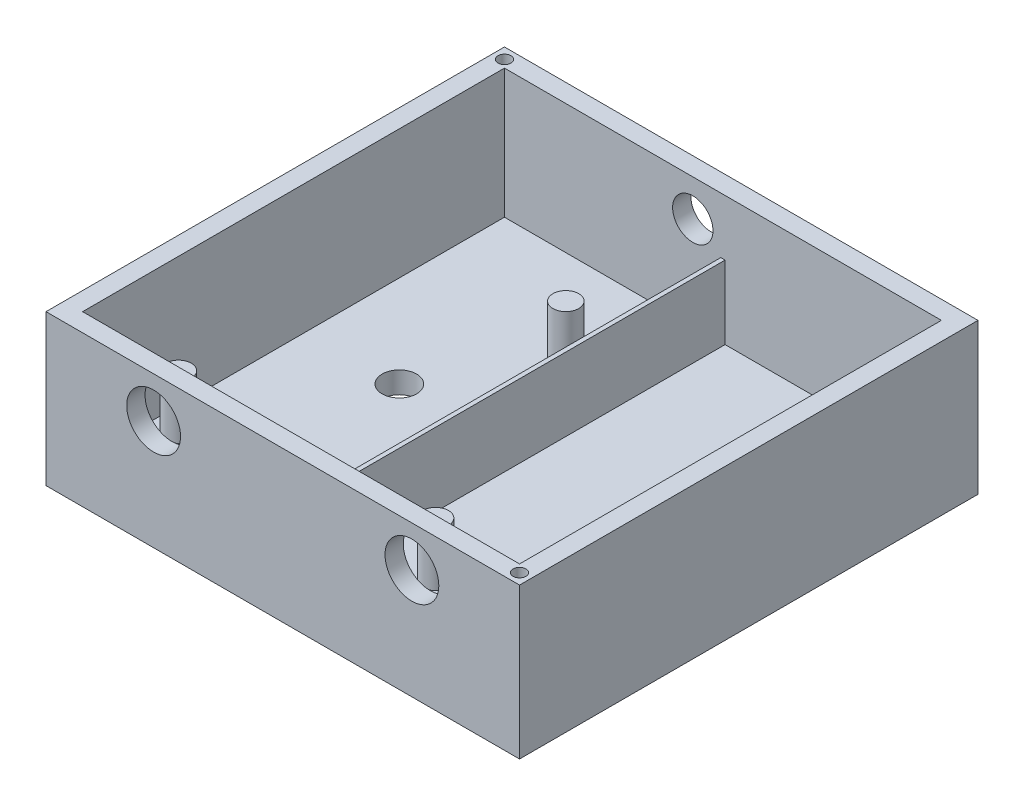
ISO-10303-21;
HEADER;
FILE_DESCRIPTION(('STEP AP214'),'2;1');
FILE_NAME('part.step','',(''),(''),'','','');
FILE_SCHEMA(('AUTOMOTIVE_DESIGN { 1 0 10303 214 1 1 1 1 }'));
ENDSEC;
DATA;
#1=APPLICATION_CONTEXT('core data for automotive mechanical design processes');
#2=APPLICATION_PROTOCOL_DEFINITION('international standard','automotive_design',2000,#1);
#3=PRODUCT_CONTEXT('',#1,'mechanical');
#4=PRODUCT('Part','Part','',(#3));
#5=PRODUCT_RELATED_PRODUCT_CATEGORY('part','',(#4));
#6=PRODUCT_DEFINITION_FORMATION('','',#4);
#7=PRODUCT_DEFINITION_CONTEXT('part definition',#1,'design');
#8=PRODUCT_DEFINITION('design','',#6,#7);
#9=PRODUCT_DEFINITION_SHAPE('','',#8);
#10=(LENGTH_UNIT() NAMED_UNIT(*) SI_UNIT(.MILLI.,.METRE.));
#11=(NAMED_UNIT(*) PLANE_ANGLE_UNIT() SI_UNIT($,.RADIAN.));
#12=(NAMED_UNIT(*) SI_UNIT($,.STERADIAN.) SOLID_ANGLE_UNIT());
#13=UNCERTAINTY_MEASURE_WITH_UNIT(LENGTH_MEASURE(1.E-05),#10,'distance_accuracy_value','');
#14=(GEOMETRIC_REPRESENTATION_CONTEXT(3) GLOBAL_UNCERTAINTY_ASSIGNED_CONTEXT((#13)) GLOBAL_UNIT_ASSIGNED_CONTEXT((#10,
#11,#12)) REPRESENTATION_CONTEXT('',''));
#15=CARTESIAN_POINT('',(0.,0.,0.));
#16=DIRECTION('',(0.,0.,1.));
#17=DIRECTION('',(1.,0.,0.));
#18=AXIS2_PLACEMENT_3D('',#15,#16,#17);
#19=CARTESIAN_POINT('',(2.15900000000001,2.54,-51.943));
#20=DIRECTION('',(0.,0.,-1.));
#21=DIRECTION('',(-1.,0.,0.));
#22=AXIS2_PLACEMENT_3D('',#19,#20,#21);
#23=PLANE('',#22);
#24=CARTESIAN_POINT('',(24.384,13.462,-51.943));
#25=DIRECTION('',(0.,0.,-1.));
#26=DIRECTION('',(-1.,0.,0.));
#27=AXIS2_PLACEMENT_3D('',#24,#25,#26);
#28=CIRCLE('',#27,2.38125);
#29=CARTESIAN_POINT('',(22.00275,13.462,-51.943));
#30=VERTEX_POINT('',#29);
#31=EDGE_CURVE('E269',#30,#30,#28,.T.);
#32=ORIENTED_EDGE('',*,*,#31,.T.);
#33=EDGE_LOOP('',(#32));
#34=FACE_BOUND('',#33,.T.);
#35=DIRECTION('',(0.,-1.,0.));
#36=VECTOR('',#35,1.);
#37=CARTESIAN_POINT('',(28.194,11.176,-51.943));
#38=LINE('',#37,#36);
#39=CARTESIAN_POINT('',(28.194,11.176,-51.943));
#40=VERTEX_POINT('',#39);
#41=CARTESIAN_POINT('',(28.194,2.54,-51.943));
#42=VERTEX_POINT('',#41);
#43=EDGE_CURVE('E136',#40,#42,#38,.T.);
#44=ORIENTED_EDGE('',*,*,#43,.T.);
#45=DIRECTION('',(-1.,0.,0.));
#46=VECTOR('',#45,1.);
#47=CARTESIAN_POINT('',(2.15900000000001,2.54,-51.943));
#48=LINE('',#47,#46);
#49=CARTESIAN_POINT('',(53.721,2.54,-51.943));
#50=VERTEX_POINT('',#49);
#51=EDGE_CURVE('E196',#50,#42,#48,.T.);
#52=ORIENTED_EDGE('',*,*,#51,.F.);
#53=DIRECTION('',(0.,1.,0.));
#54=VECTOR('',#53,1.);
#55=CARTESIAN_POINT('',(53.721,2.54,-51.943));
#56=LINE('',#55,#54);
#57=CARTESIAN_POINT('',(53.721,17.78,-51.943));
#58=VERTEX_POINT('',#57);
#59=EDGE_CURVE('E211',#50,#58,#56,.T.);
#60=ORIENTED_EDGE('',*,*,#59,.T.);
#61=DIRECTION('',(-1.,0.,0.));
#62=VECTOR('',#61,1.);
#63=CARTESIAN_POINT('',(2.15900000000001,17.78,-51.943));
#64=LINE('',#63,#62);
#65=CARTESIAN_POINT('',(2.15900000000001,17.78,-51.943));
#66=VERTEX_POINT('',#65);
#67=EDGE_CURVE('E188',#58,#66,#64,.T.);
#68=ORIENTED_EDGE('',*,*,#67,.T.);
#69=DIRECTION('',(0.,1.,0.));
#70=VECTOR('',#69,1.);
#71=CARTESIAN_POINT('',(2.15900000000001,2.54,-51.943));
#72=LINE('',#71,#70);
#73=CARTESIAN_POINT('',(2.15900000000001,2.54,-51.943));
#74=VERTEX_POINT('',#73);
#75=EDGE_CURVE('E208',#74,#66,#72,.T.);
#76=ORIENTED_EDGE('',*,*,#75,.F.);
#77=CARTESIAN_POINT('',(27.686,2.54,-51.943));
#78=VERTEX_POINT('',#77);
#79=EDGE_CURVE('E195',#78,#74,#48,.T.);
#80=ORIENTED_EDGE('',*,*,#79,.F.);
#81=DIRECTION('',(0.,-1.,0.));
#82=VECTOR('',#81,1.);
#83=CARTESIAN_POINT('',(27.686,11.176,-51.943));
#84=LINE('',#83,#82);
#85=CARTESIAN_POINT('',(27.686,11.176,-51.943));
#86=VERTEX_POINT('',#85);
#87=EDGE_CURVE('E50',#86,#78,#84,.T.);
#88=ORIENTED_EDGE('',*,*,#87,.F.);
#89=DIRECTION('',(-1.,0.,0.));
#90=VECTOR('',#89,1.);
#91=CARTESIAN_POINT('',(27.686,11.176,-51.943));
#92=LINE('',#91,#90);
#93=EDGE_CURVE('E128',#40,#86,#92,.T.);
#94=ORIENTED_EDGE('',*,*,#93,.F.);
#95=EDGE_LOOP('',(#44,#52,#60,#68,#76,#80,#88,#94));
#96=FACE_BOUND('',#95,.T.);
#97=ADVANCED_FACE('F33',(#34,#96),#23,.F.);
#98=CARTESIAN_POINT('',(2.15900000000001,2.54,-2.159));
#99=DIRECTION('',(0.,0.,1.));
#100=DIRECTION('',(1.,0.,0.));
#101=AXIS2_PLACEMENT_3D('',#98,#99,#100);
#102=PLANE('',#101);
#103=CARTESIAN_POINT('',(12.7,12.954,-2.159));
#104=DIRECTION('',(0.,0.,1.));
#105=DIRECTION('',(1.,0.,0.));
#106=AXIS2_PLACEMENT_3D('',#103,#104,#105);
#107=CIRCLE('',#106,3.175);
#108=CARTESIAN_POINT('',(15.875,12.954,-2.159));
#109=VERTEX_POINT('',#108);
#110=EDGE_CURVE('E154',#109,#109,#107,.T.);
#111=ORIENTED_EDGE('',*,*,#110,.T.);
#112=EDGE_LOOP('',(#111));
#113=FACE_BOUND('',#112,.T.);
#114=CARTESIAN_POINT('',(43.18,12.954,-2.159));
#115=DIRECTION('',(0.,0.,1.));
#116=DIRECTION('',(1.,0.,0.));
#117=AXIS2_PLACEMENT_3D('',#114,#115,#116);
#118=CIRCLE('',#117,3.175);
#119=CARTESIAN_POINT('',(46.355,12.954,-2.159));
#120=VERTEX_POINT('',#119);
#121=EDGE_CURVE('E276',#120,#120,#118,.T.);
#122=ORIENTED_EDGE('',*,*,#121,.T.);
#123=EDGE_LOOP('',(#122));
#124=FACE_BOUND('',#123,.T.);
#125=DIRECTION('',(0.,-1.,0.));
#126=VECTOR('',#125,1.);
#127=CARTESIAN_POINT('',(28.194,11.176,-2.159));
#128=LINE('',#127,#126);
#129=CARTESIAN_POINT('',(28.194,11.176,-2.159));
#130=VERTEX_POINT('',#129);
#131=CARTESIAN_POINT('',(28.194,2.54,-2.159));
#132=VERTEX_POINT('',#131);
#133=EDGE_CURVE('E152',#130,#132,#128,.T.);
#134=ORIENTED_EDGE('',*,*,#133,.F.);
#135=DIRECTION('',(1.,0.,0.));
#136=VECTOR('',#135,1.);
#137=CARTESIAN_POINT('',(27.686,11.176,-2.159));
#138=LINE('',#137,#136);
#139=CARTESIAN_POINT('',(27.686,11.176,-2.159));
#140=VERTEX_POINT('',#139);
#141=EDGE_CURVE('E130',#140,#130,#138,.T.);
#142=ORIENTED_EDGE('',*,*,#141,.F.);
#143=DIRECTION('',(0.,-1.,0.));
#144=VECTOR('',#143,1.);
#145=CARTESIAN_POINT('',(27.686,11.176,-2.159));
#146=LINE('',#145,#144);
#147=CARTESIAN_POINT('',(27.686,2.54,-2.159));
#148=VERTEX_POINT('',#147);
#149=EDGE_CURVE('E157',#140,#148,#146,.T.);
#150=ORIENTED_EDGE('',*,*,#149,.T.);
#151=DIRECTION('',(1.,0.,0.));
#152=VECTOR('',#151,1.);
#153=CARTESIAN_POINT('',(2.15900000000001,2.54,-2.159));
#154=LINE('',#153,#152);
#155=CARTESIAN_POINT('',(2.15900000000001,2.54,-2.159));
#156=VERTEX_POINT('',#155);
#157=EDGE_CURVE('E189',#156,#148,#154,.T.);
#158=ORIENTED_EDGE('',*,*,#157,.F.);
#159=DIRECTION('',(0.,1.,0.));
#160=VECTOR('',#159,1.);
#161=CARTESIAN_POINT('',(2.15900000000001,2.54,-2.159));
#162=LINE('',#161,#160);
#163=CARTESIAN_POINT('',(2.15900000000001,17.78,-2.159));
#164=VERTEX_POINT('',#163);
#165=EDGE_CURVE('E198',#156,#164,#162,.T.);
#166=ORIENTED_EDGE('',*,*,#165,.T.);
#167=DIRECTION('',(1.,0.,0.));
#168=VECTOR('',#167,1.);
#169=CARTESIAN_POINT('',(2.15900000000001,17.78,-2.159));
#170=LINE('',#169,#168);
#171=CARTESIAN_POINT('',(53.721,17.78,-2.159));
#172=VERTEX_POINT('',#171);
#173=EDGE_CURVE('E200',#164,#172,#170,.T.);
#174=ORIENTED_EDGE('',*,*,#173,.T.);
#175=DIRECTION('',(0.,1.,0.));
#176=VECTOR('',#175,1.);
#177=CARTESIAN_POINT('',(53.721,2.54,-2.159));
#178=LINE('',#177,#176);
#179=CARTESIAN_POINT('',(53.721,2.54,-2.159));
#180=VERTEX_POINT('',#179);
#181=EDGE_CURVE('E213',#180,#172,#178,.T.);
#182=ORIENTED_EDGE('',*,*,#181,.F.);
#183=EDGE_CURVE('E187',#132,#180,#154,.T.);
#184=ORIENTED_EDGE('',*,*,#183,.F.);
#185=EDGE_LOOP('',(#134,#142,#150,#158,#166,#174,#182,#184));
#186=FACE_BOUND('',#185,.T.);
#187=ADVANCED_FACE('F283',(#113,#124,#186),#102,.F.);
#188=CARTESIAN_POINT('',(0.,2.54,0.));
#189=DIRECTION('',(0.,1.,0.));
#190=DIRECTION('',(0.,0.,1.));
#191=AXIS2_PLACEMENT_3D('',#188,#189,#190);
#192=PLANE('',#191);
#193=CARTESIAN_POINT('',(42.5875597592206,2.54,-28.702));
#194=DIRECTION('',(0.,1.,0.));
#195=DIRECTION('',(0.,0.,1.));
#196=AXIS2_PLACEMENT_3D('',#193,#194,#195);
#197=CIRCLE('',#196,2.032);
#198=CARTESIAN_POINT('',(42.5875597592206,2.54,-26.67));
#199=VERTEX_POINT('',#198);
#200=EDGE_CURVE('E246',#199,#199,#197,.T.);
#201=ORIENTED_EDGE('',*,*,#200,.F.);
#202=EDGE_LOOP('',(#201));
#203=FACE_BOUND('',#202,.T.);
#204=CARTESIAN_POINT('',(35.179,2.54,-10.795));
#205=DIRECTION('',(0.,1.,0.));
#206=DIRECTION('',(0.,0.,1.));
#207=AXIS2_PLACEMENT_3D('',#204,#205,#206);
#208=CIRCLE('',#207,1.52400000000001);
#209=CARTESIAN_POINT('',(35.179,2.54,-9.27099999999999));
#210=VERTEX_POINT('',#209);
#211=EDGE_CURVE('E143',#210,#210,#208,.T.);
#212=ORIENTED_EDGE('',*,*,#211,.F.);
#213=EDGE_LOOP('',(#212));
#214=FACE_BOUND('',#213,.T.);
#215=CARTESIAN_POINT('',(50.927,2.54,-40.767));
#216=DIRECTION('',(0.,1.,0.));
#217=DIRECTION('',(0.,0.,1.));
#218=AXIS2_PLACEMENT_3D('',#215,#216,#217);
#219=CIRCLE('',#218,1.524);
#220=CARTESIAN_POINT('',(50.927,2.54,-39.243));
#221=VERTEX_POINT('',#220);
#222=EDGE_CURVE('E164',#221,#221,#219,.T.);
#223=ORIENTED_EDGE('',*,*,#222,.F.);
#224=EDGE_LOOP('',(#223));
#225=FACE_BOUND('',#224,.T.);
#226=ORIENTED_EDGE('',*,*,#51,.T.);
#227=DIRECTION('',(0.,0.,-1.));
#228=VECTOR('',#227,1.);
#229=CARTESIAN_POINT('',(28.194,2.54,-51.943));
#230=LINE('',#229,#228);
#231=EDGE_CURVE('E139',#132,#42,#230,.T.);
#232=ORIENTED_EDGE('',*,*,#231,.F.);
#233=ORIENTED_EDGE('',*,*,#183,.T.);
#234=DIRECTION('',(0.,0.,-1.));
#235=VECTOR('',#234,1.);
#236=CARTESIAN_POINT('',(53.721,2.54,-51.943));
#237=LINE('',#236,#235);
#238=EDGE_CURVE('E192',#180,#50,#237,.T.);
#239=ORIENTED_EDGE('',*,*,#238,.T.);
#240=EDGE_LOOP('',(#226,#232,#233,#239));
#241=FACE_BOUND('',#240,.T.);
#242=ADVANCED_FACE('F307',(#203,#214,#225,#241),#192,.T.);
#243=CARTESIAN_POINT('',(12.9965597592206,2.54,-28.702));
#244=DIRECTION('',(0.,1.,0.));
#245=DIRECTION('',(0.,0.,1.));
#246=AXIS2_PLACEMENT_3D('',#243,#244,#245);
#247=CIRCLE('',#246,2.032);
#248=CARTESIAN_POINT('',(12.9965597592206,2.54,-26.67));
#249=VERTEX_POINT('',#248);
#250=EDGE_CURVE('E258',#249,#249,#247,.T.);
#251=ORIENTED_EDGE('',*,*,#250,.F.);
#252=EDGE_LOOP('',(#251));
#253=FACE_BOUND('',#252,.T.);
#254=CARTESIAN_POINT('',(20.701,2.54,-40.64));
#255=DIRECTION('',(0.,1.,0.));
#256=DIRECTION('',(0.,0.,1.));
#257=AXIS2_PLACEMENT_3D('',#254,#255,#256);
#258=CIRCLE('',#257,1.524);
#259=CARTESIAN_POINT('',(20.701,2.54,-39.116));
#260=VERTEX_POINT('',#259);
#261=EDGE_CURVE('E176',#260,#260,#258,.T.);
#262=ORIENTED_EDGE('',*,*,#261,.F.);
#263=EDGE_LOOP('',(#262));
#264=FACE_BOUND('',#263,.T.);
#265=CARTESIAN_POINT('',(4.953,2.54,-10.668));
#266=DIRECTION('',(0.,1.,0.));
#267=DIRECTION('',(0.,0.,1.));
#268=AXIS2_PLACEMENT_3D('',#265,#266,#267);
#269=CIRCLE('',#268,1.524);
#270=CARTESIAN_POINT('',(4.953,2.54,-9.144));
#271=VERTEX_POINT('',#270);
#272=EDGE_CURVE('E170',#271,#271,#269,.T.);
#273=ORIENTED_EDGE('',*,*,#272,.F.);
#274=EDGE_LOOP('',(#273));
#275=FACE_BOUND('',#274,.T.);
#276=ORIENTED_EDGE('',*,*,#157,.T.);
#277=DIRECTION('',(0.,0.,1.));
#278=VECTOR('',#277,1.);
#279=CARTESIAN_POINT('',(27.686,2.54,-51.943));
#280=LINE('',#279,#278);
#281=EDGE_CURVE('E133',#78,#148,#280,.T.);
#282=ORIENTED_EDGE('',*,*,#281,.F.);
#283=ORIENTED_EDGE('',*,*,#79,.T.);
#284=DIRECTION('',(0.,0.,1.));
#285=VECTOR('',#284,1.);
#286=CARTESIAN_POINT('',(2.15900000000001,2.54,-51.943));
#287=LINE('',#286,#285);
#288=EDGE_CURVE('E184',#74,#156,#287,.T.);
#289=ORIENTED_EDGE('',*,*,#288,.T.);
#290=EDGE_LOOP('',(#276,#282,#283,#289));
#291=FACE_BOUND('',#290,.T.);
#292=ADVANCED_FACE('F341',(#253,#264,#275,#291),#192,.T.);
#293=CARTESIAN_POINT('',(0.,17.78,0.));
#294=DIRECTION('',(1.,0.,0.));
#295=DIRECTION('',(0.,0.,-1.));
#296=AXIS2_PLACEMENT_3D('',#293,#294,#295);
#297=PLANE('',#296);
#298=DIRECTION('',(0.,0.,1.));
#299=VECTOR('',#298,1.);
#300=CARTESIAN_POINT('',(0.,0.,0.));
#301=LINE('',#300,#299);
#302=CARTESIAN_POINT('',(0.,0.,-54.102));
#303=VERTEX_POINT('',#302);
#304=CARTESIAN_POINT('',(0.,0.,0.));
#305=VERTEX_POINT('',#304);
#306=EDGE_CURVE('E210',#303,#305,#301,.T.);
#307=ORIENTED_EDGE('',*,*,#306,.T.);
#308=DIRECTION('',(0.,-1.,0.));
#309=VECTOR('',#308,1.);
#310=CARTESIAN_POINT('',(0.,17.78,0.));
#311=LINE('',#310,#309);
#312=CARTESIAN_POINT('',(0.,17.78,0.));
#313=VERTEX_POINT('',#312);
#314=EDGE_CURVE('E11',#313,#305,#311,.T.);
#315=ORIENTED_EDGE('',*,*,#314,.F.);
#316=DIRECTION('',(0.,0.,1.));
#317=VECTOR('',#316,1.);
#318=CARTESIAN_POINT('',(0.,17.78,0.));
#319=LINE('',#318,#317);
#320=CARTESIAN_POINT('',(0.,17.78,-54.102));
#321=VERTEX_POINT('',#320);
#322=EDGE_CURVE('E216',#321,#313,#319,.T.);
#323=ORIENTED_EDGE('',*,*,#322,.F.);
#324=DIRECTION('',(0.,-1.,0.));
#325=VECTOR('',#324,1.);
#326=CARTESIAN_POINT('',(0.,17.78,-54.102));
#327=LINE('',#326,#325);
#328=EDGE_CURVE('E226',#321,#303,#327,.T.);
#329=ORIENTED_EDGE('',*,*,#328,.T.);
#330=EDGE_LOOP('',(#307,#315,#323,#329));
#331=FACE_BOUND('',#330,.T.);
#332=ADVANCED_FACE('F35',(#331),#297,.F.);
#333=CARTESIAN_POINT('',(0.,17.78,0.));
#334=DIRECTION('',(0.,0.,-1.));
#335=DIRECTION('',(-1.,0.,0.));
#336=AXIS2_PLACEMENT_3D('',#333,#334,#335);
#337=PLANE('',#336);
#338=CARTESIAN_POINT('',(12.7,12.954,0.));
#339=DIRECTION('',(0.,0.,1.));
#340=DIRECTION('',(1.,0.,0.));
#341=AXIS2_PLACEMENT_3D('',#338,#339,#340);
#342=CIRCLE('',#341,3.175);
#343=CARTESIAN_POINT('',(15.875,12.954,0.));
#344=VERTEX_POINT('',#343);
#345=EDGE_CURVE('E273',#344,#344,#342,.T.);
#346=ORIENTED_EDGE('',*,*,#345,.F.);
#347=EDGE_LOOP('',(#346));
#348=FACE_BOUND('',#347,.T.);
#349=CARTESIAN_POINT('',(43.18,12.954,0.));
#350=DIRECTION('',(0.,0.,1.));
#351=DIRECTION('',(1.,0.,0.));
#352=AXIS2_PLACEMENT_3D('',#349,#350,#351);
#353=CIRCLE('',#352,3.175);
#354=CARTESIAN_POINT('',(46.355,12.954,0.));
#355=VERTEX_POINT('',#354);
#356=EDGE_CURVE('E272',#355,#355,#353,.T.);
#357=ORIENTED_EDGE('',*,*,#356,.F.);
#358=EDGE_LOOP('',(#357));
#359=FACE_BOUND('',#358,.T.);
#360=DIRECTION('',(1.,0.,0.));
#361=VECTOR('',#360,1.);
#362=CARTESIAN_POINT('',(0.,0.,0.));
#363=LINE('',#362,#361);
#364=CARTESIAN_POINT('',(55.88,0.,0.));
#365=VERTEX_POINT('',#364);
#366=EDGE_CURVE('E229',#305,#365,#363,.T.);
#367=ORIENTED_EDGE('',*,*,#366,.T.);
#368=DIRECTION('',(0.,-1.,0.));
#369=VECTOR('',#368,1.);
#370=CARTESIAN_POINT('',(55.88,17.78,0.));
#371=LINE('',#370,#369);
#372=CARTESIAN_POINT('',(55.88,17.78,0.));
#373=VERTEX_POINT('',#372);
#374=EDGE_CURVE('E42',#373,#365,#371,.T.);
#375=ORIENTED_EDGE('',*,*,#374,.F.);
#376=DIRECTION('',(1.,0.,0.));
#377=VECTOR('',#376,1.);
#378=CARTESIAN_POINT('',(0.,17.78,0.));
#379=LINE('',#378,#377);
#380=EDGE_CURVE('E219',#313,#373,#379,.T.);
#381=ORIENTED_EDGE('',*,*,#380,.F.);
#382=ORIENTED_EDGE('',*,*,#314,.T.);
#383=EDGE_LOOP('',(#367,#375,#381,#382));
#384=FACE_BOUND('',#383,.T.);
#385=ADVANCED_FACE('F334',(#348,#359,#384),#337,.F.);
#386=CARTESIAN_POINT('',(55.88,17.78,0.));
#387=DIRECTION('',(-1.,0.,0.));
#388=DIRECTION('',(0.,0.,1.));
#389=AXIS2_PLACEMENT_3D('',#386,#387,#388);
#390=PLANE('',#389);
#391=DIRECTION('',(0.,0.,-1.));
#392=VECTOR('',#391,1.);
#393=CARTESIAN_POINT('',(55.88,0.,0.));
#394=LINE('',#393,#392);
#395=CARTESIAN_POINT('',(55.88,0.,-54.102));
#396=VERTEX_POINT('',#395);
#397=EDGE_CURVE('E231',#365,#396,#394,.T.);
#398=ORIENTED_EDGE('',*,*,#397,.T.);
#399=DIRECTION('',(0.,-1.,0.));
#400=VECTOR('',#399,1.);
#401=CARTESIAN_POINT('',(55.88,17.78,-54.102));
#402=LINE('',#401,#400);
#403=CARTESIAN_POINT('',(55.88,17.78,-54.102));
#404=VERTEX_POINT('',#403);
#405=EDGE_CURVE('E236',#404,#396,#402,.T.);
#406=ORIENTED_EDGE('',*,*,#405,.F.);
#407=DIRECTION('',(0.,0.,-1.));
#408=VECTOR('',#407,1.);
#409=CARTESIAN_POINT('',(55.88,17.78,0.));
#410=LINE('',#409,#408);
#411=EDGE_CURVE('E222',#373,#404,#410,.T.);
#412=ORIENTED_EDGE('',*,*,#411,.F.);
#413=ORIENTED_EDGE('',*,*,#374,.T.);
#414=EDGE_LOOP('',(#398,#406,#412,#413));
#415=FACE_BOUND('',#414,.T.);
#416=ADVANCED_FACE('F331',(#415),#390,.F.);
#417=CARTESIAN_POINT('',(0.,17.78,-54.102));
#418=DIRECTION('',(0.,0.,1.));
#419=DIRECTION('',(1.,0.,0.));
#420=AXIS2_PLACEMENT_3D('',#417,#418,#419);
#421=PLANE('',#420);
#422=CARTESIAN_POINT('',(24.384,13.462,-54.102));
#423=DIRECTION('',(0.,0.,-1.));
#424=DIRECTION('',(-1.,0.,0.));
#425=AXIS2_PLACEMENT_3D('',#422,#423,#424);
#426=CIRCLE('',#425,2.38125);
#427=CARTESIAN_POINT('',(22.00275,13.462,-54.102));
#428=VERTEX_POINT('',#427);
#429=EDGE_CURVE('E264',#428,#428,#426,.T.);
#430=ORIENTED_EDGE('',*,*,#429,.F.);
#431=EDGE_LOOP('',(#430));
#432=FACE_BOUND('',#431,.T.);
#433=DIRECTION('',(-1.,0.,0.));
#434=VECTOR('',#433,1.);
#435=CARTESIAN_POINT('',(0.,0.,-54.102));
#436=LINE('',#435,#434);
#437=EDGE_CURVE('E220',#396,#303,#436,.T.);
#438=ORIENTED_EDGE('',*,*,#437,.T.);
#439=ORIENTED_EDGE('',*,*,#328,.F.);
#440=DIRECTION('',(-1.,0.,0.));
#441=VECTOR('',#440,1.);
#442=CARTESIAN_POINT('',(0.,17.78,-54.102));
#443=LINE('',#442,#441);
#444=EDGE_CURVE('E224',#404,#321,#443,.T.);
#445=ORIENTED_EDGE('',*,*,#444,.F.);
#446=ORIENTED_EDGE('',*,*,#405,.T.);
#447=EDGE_LOOP('',(#438,#439,#445,#446));
#448=FACE_BOUND('',#447,.T.);
#449=ADVANCED_FACE('F324',(#432,#448),#421,.F.);
#450=CARTESIAN_POINT('',(0.,17.78,0.));
#451=DIRECTION('',(0.,-1.,0.));
#452=DIRECTION('',(0.,0.,-1.));
#453=AXIS2_PLACEMENT_3D('',#450,#451,#452);
#454=PLANE('',#453);
#455=CARTESIAN_POINT('',(1.27,17.78,-52.832));
#456=DIRECTION('',(0.,1.,0.));
#457=DIRECTION('',(0.,0.,1.));
#458=AXIS2_PLACEMENT_3D('',#455,#456,#457);
#459=CIRCLE('',#458,0.762);
#460=CARTESIAN_POINT('',(1.27,17.78,-52.07));
#461=VERTEX_POINT('',#460);
#462=EDGE_CURVE('E242',#461,#461,#459,.T.);
#463=ORIENTED_EDGE('',*,*,#462,.F.);
#464=EDGE_LOOP('',(#463));
#465=FACE_BOUND('',#464,.T.);
#466=CARTESIAN_POINT('',(54.61,17.78,-1.27));
#467=DIRECTION('',(0.,1.,0.));
#468=DIRECTION('',(0.,0.,1.));
#469=AXIS2_PLACEMENT_3D('',#466,#467,#468);
#470=CIRCLE('',#469,0.761999999999996);
#471=CARTESIAN_POINT('',(54.61,17.78,-0.508000000000004));
#472=VERTEX_POINT('',#471);
#473=EDGE_CURVE('E248',#472,#472,#470,.T.);
#474=ORIENTED_EDGE('',*,*,#473,.F.);
#475=EDGE_LOOP('',(#474));
#476=FACE_BOUND('',#475,.T.);
#477=ORIENTED_EDGE('',*,*,#173,.F.);
#478=DIRECTION('',(0.,0.,1.));
#479=VECTOR('',#478,1.);
#480=CARTESIAN_POINT('',(2.15900000000001,17.78,-51.943));
#481=LINE('',#480,#479);
#482=EDGE_CURVE('E58',#66,#164,#481,.T.);
#483=ORIENTED_EDGE('',*,*,#482,.F.);
#484=ORIENTED_EDGE('',*,*,#67,.F.);
#485=DIRECTION('',(0.,0.,-1.));
#486=VECTOR('',#485,1.);
#487=CARTESIAN_POINT('',(53.721,17.78,-51.943));
#488=LINE('',#487,#486);
#489=EDGE_CURVE('E203',#172,#58,#488,.T.);
#490=ORIENTED_EDGE('',*,*,#489,.F.);
#491=EDGE_LOOP('',(#477,#483,#484,#490));
#492=FACE_BOUND('',#491,.T.);
#493=ORIENTED_EDGE('',*,*,#322,.T.);
#494=ORIENTED_EDGE('',*,*,#380,.T.);
#495=ORIENTED_EDGE('',*,*,#411,.T.);
#496=ORIENTED_EDGE('',*,*,#444,.T.);
#497=EDGE_LOOP('',(#493,#494,#495,#496));
#498=FACE_BOUND('',#497,.T.);
#499=ADVANCED_FACE('F321',(#465,#476,#492,#498),#454,.F.);
#500=CARTESIAN_POINT('',(0.,0.,0.));
#501=DIRECTION('',(0.,-1.,0.));
#502=DIRECTION('',(0.,0.,-1.));
#503=AXIS2_PLACEMENT_3D('',#500,#501,#502);
#504=PLANE('',#503);
#505=CARTESIAN_POINT('',(1.27,0.,-52.832));
#506=DIRECTION('',(0.,-1.,0.));
#507=DIRECTION('',(0.,0.,-1.));
#508=AXIS2_PLACEMENT_3D('',#505,#506,#507);
#509=CIRCLE('',#508,0.762);
#510=CARTESIAN_POINT('',(1.27,0.,-53.594));
#511=VERTEX_POINT('',#510);
#512=EDGE_CURVE('E37',#511,#511,#509,.T.);
#513=ORIENTED_EDGE('',*,*,#512,.F.);
#514=EDGE_LOOP('',(#513));
#515=FACE_BOUND('',#514,.T.);
#516=CARTESIAN_POINT('',(54.61,0.,-1.27));
#517=DIRECTION('',(0.,-1.,0.));
#518=DIRECTION('',(0.,0.,-1.));
#519=AXIS2_PLACEMENT_3D('',#516,#517,#518);
#520=CIRCLE('',#519,0.761999999999996);
#521=CARTESIAN_POINT('',(54.61,0.,-2.032));
#522=VERTEX_POINT('',#521);
#523=EDGE_CURVE('E240',#522,#522,#520,.T.);
#524=ORIENTED_EDGE('',*,*,#523,.F.);
#525=EDGE_LOOP('',(#524));
#526=FACE_BOUND('',#525,.T.);
#527=CARTESIAN_POINT('',(42.5875597592206,0.,-28.702));
#528=DIRECTION('',(0.,1.,0.));
#529=DIRECTION('',(0.,0.,1.));
#530=AXIS2_PLACEMENT_3D('',#527,#528,#529);
#531=CIRCLE('',#530,2.032);
#532=CARTESIAN_POINT('',(42.5875597592206,0.,-26.67));
#533=VERTEX_POINT('',#532);
#534=EDGE_CURVE('E255',#533,#533,#531,.T.);
#535=ORIENTED_EDGE('',*,*,#534,.T.);
#536=EDGE_LOOP('',(#535));
#537=FACE_BOUND('',#536,.T.);
#538=CARTESIAN_POINT('',(12.9965597592206,0.,-28.702));
#539=DIRECTION('',(0.,1.,0.));
#540=DIRECTION('',(0.,0.,1.));
#541=AXIS2_PLACEMENT_3D('',#538,#539,#540);
#542=CIRCLE('',#541,2.032);
#543=CARTESIAN_POINT('',(12.9965597592206,0.,-26.67));
#544=VERTEX_POINT('',#543);
#545=EDGE_CURVE('E261',#544,#544,#542,.T.);
#546=ORIENTED_EDGE('',*,*,#545,.T.);
#547=EDGE_LOOP('',(#546));
#548=FACE_BOUND('',#547,.T.);
#549=ORIENTED_EDGE('',*,*,#306,.F.);
#550=ORIENTED_EDGE('',*,*,#437,.F.);
#551=ORIENTED_EDGE('',*,*,#397,.F.);
#552=ORIENTED_EDGE('',*,*,#366,.F.);
#553=EDGE_LOOP('',(#549,#550,#551,#552));
#554=FACE_BOUND('',#553,.T.);
#555=ADVANCED_FACE('F320',(#515,#526,#537,#548,#554),#504,.T.);
#556=CARTESIAN_POINT('',(2.15900000000001,2.54,-51.943));
#557=DIRECTION('',(-1.,0.,0.));
#558=DIRECTION('',(0.,0.,1.));
#559=AXIS2_PLACEMENT_3D('',#556,#557,#558);
#560=PLANE('',#559);
#561=ORIENTED_EDGE('',*,*,#482,.T.);
#562=ORIENTED_EDGE('',*,*,#165,.F.);
#563=ORIENTED_EDGE('',*,*,#288,.F.);
#564=ORIENTED_EDGE('',*,*,#75,.T.);
#565=EDGE_LOOP('',(#561,#562,#563,#564));
#566=FACE_BOUND('',#565,.T.);
#567=ADVANCED_FACE('F315',(#566),#560,.F.);
#568=CARTESIAN_POINT('',(53.721,2.54,-51.943));
#569=DIRECTION('',(1.,0.,0.));
#570=DIRECTION('',(0.,0.,-1.));
#571=AXIS2_PLACEMENT_3D('',#568,#569,#570);
#572=PLANE('',#571);
#573=ORIENTED_EDGE('',*,*,#489,.T.);
#574=ORIENTED_EDGE('',*,*,#59,.F.);
#575=ORIENTED_EDGE('',*,*,#238,.F.);
#576=ORIENTED_EDGE('',*,*,#181,.T.);
#577=EDGE_LOOP('',(#573,#574,#575,#576));
#578=FACE_BOUND('',#577,.T.);
#579=ADVANCED_FACE('F312',(#578),#572,.F.);
#580=CARTESIAN_POINT('',(20.701,8.89,-40.64));
#581=DIRECTION('',(0.,-1.,0.));
#582=DIRECTION('',(0.,0.,-1.));
#583=AXIS2_PLACEMENT_3D('',#580,#581,#582);
#584=CYLINDRICAL_SURFACE('',#583,1.524);
#585=CARTESIAN_POINT('',(20.701,8.89,-40.64));
#586=DIRECTION('',(0.,1.,0.));
#587=DIRECTION('',(0.,0.,1.));
#588=AXIS2_PLACEMENT_3D('',#585,#586,#587);
#589=CIRCLE('',#588,1.524);
#590=CARTESIAN_POINT('',(20.701,8.89,-39.116));
#591=VERTEX_POINT('',#590);
#592=EDGE_CURVE('E179',#591,#591,#589,.T.);
#593=ORIENTED_EDGE('',*,*,#592,.F.);
#594=EDGE_LOOP('',(#593));
#595=FACE_BOUND('',#594,.T.);
#596=ORIENTED_EDGE('',*,*,#261,.T.);
#597=EDGE_LOOP('',(#596));
#598=FACE_BOUND('',#597,.T.);
#599=ADVANCED_FACE('F314',(#595,#598),#584,.T.);
#600=CARTESIAN_POINT('',(20.701,8.89,-40.64));
#601=DIRECTION('',(0.,1.,0.));
#602=DIRECTION('',(0.,0.,1.));
#603=AXIS2_PLACEMENT_3D('',#600,#601,#602);
#604=PLANE('',#603);
#605=ORIENTED_EDGE('',*,*,#592,.T.);
#606=EDGE_LOOP('',(#605));
#607=FACE_BOUND('',#606,.T.);
#608=ADVANCED_FACE('F409',(#607),#604,.T.);
#609=CARTESIAN_POINT('',(4.953,8.89,-10.668));
#610=DIRECTION('',(0.,-1.,0.));
#611=DIRECTION('',(0.,0.,-1.));
#612=AXIS2_PLACEMENT_3D('',#609,#610,#611);
#613=CYLINDRICAL_SURFACE('',#612,1.524);
#614=CARTESIAN_POINT('',(4.953,8.89,-10.668));
#615=DIRECTION('',(0.,1.,0.));
#616=DIRECTION('',(0.,0.,1.));
#617=AXIS2_PLACEMENT_3D('',#614,#615,#616);
#618=CIRCLE('',#617,1.524);
#619=CARTESIAN_POINT('',(4.953,8.89,-9.144));
#620=VERTEX_POINT('',#619);
#621=EDGE_CURVE('E173',#620,#620,#618,.T.);
#622=ORIENTED_EDGE('',*,*,#621,.F.);
#623=EDGE_LOOP('',(#622));
#624=FACE_BOUND('',#623,.T.);
#625=ORIENTED_EDGE('',*,*,#272,.T.);
#626=EDGE_LOOP('',(#625));
#627=FACE_BOUND('',#626,.T.);
#628=ADVANCED_FACE('F405',(#624,#627),#613,.T.);
#629=CARTESIAN_POINT('',(4.953,8.89,-10.668));
#630=DIRECTION('',(0.,1.,0.));
#631=DIRECTION('',(0.,0.,1.));
#632=AXIS2_PLACEMENT_3D('',#629,#630,#631);
#633=PLANE('',#632);
#634=ORIENTED_EDGE('',*,*,#621,.T.);
#635=EDGE_LOOP('',(#634));
#636=FACE_BOUND('',#635,.T.);
#637=ADVANCED_FACE('F401',(#636),#633,.T.);
#638=CARTESIAN_POINT('',(50.927,8.89,-40.767));
#639=DIRECTION('',(0.,-1.,0.));
#640=DIRECTION('',(0.,0.,-1.));
#641=AXIS2_PLACEMENT_3D('',#638,#639,#640);
#642=CYLINDRICAL_SURFACE('',#641,1.524);
#643=CARTESIAN_POINT('',(50.927,8.89,-40.767));
#644=DIRECTION('',(0.,1.,0.));
#645=DIRECTION('',(0.,0.,1.));
#646=AXIS2_PLACEMENT_3D('',#643,#644,#645);
#647=CIRCLE('',#646,1.524);
#648=CARTESIAN_POINT('',(50.927,8.89,-39.243));
#649=VERTEX_POINT('',#648);
#650=EDGE_CURVE('E167',#649,#649,#647,.T.);
#651=ORIENTED_EDGE('',*,*,#650,.F.);
#652=EDGE_LOOP('',(#651));
#653=FACE_BOUND('',#652,.T.);
#654=ORIENTED_EDGE('',*,*,#222,.T.);
#655=EDGE_LOOP('',(#654));
#656=FACE_BOUND('',#655,.T.);
#657=ADVANCED_FACE('F397',(#653,#656),#642,.T.);
#658=CARTESIAN_POINT('',(50.927,8.89,-40.767));
#659=DIRECTION('',(0.,1.,0.));
#660=DIRECTION('',(0.,0.,1.));
#661=AXIS2_PLACEMENT_3D('',#658,#659,#660);
#662=PLANE('',#661);
#663=ORIENTED_EDGE('',*,*,#650,.T.);
#664=EDGE_LOOP('',(#663));
#665=FACE_BOUND('',#664,.T.);
#666=ADVANCED_FACE('F393',(#665),#662,.T.);
#667=CARTESIAN_POINT('',(35.179,8.89,-10.795));
#668=DIRECTION('',(0.,-1.,0.));
#669=DIRECTION('',(0.,0.,-1.));
#670=AXIS2_PLACEMENT_3D('',#667,#668,#669);
#671=CYLINDRICAL_SURFACE('',#670,1.52400000000001);
#672=CARTESIAN_POINT('',(35.179,8.89,-10.795));
#673=DIRECTION('',(0.,1.,0.));
#674=DIRECTION('',(0.,0.,1.));
#675=AXIS2_PLACEMENT_3D('',#672,#673,#674);
#676=CIRCLE('',#675,1.52400000000001);
#677=CARTESIAN_POINT('',(35.179,8.89,-9.27099999999999));
#678=VERTEX_POINT('',#677);
#679=EDGE_CURVE('E161',#678,#678,#676,.T.);
#680=ORIENTED_EDGE('',*,*,#679,.F.);
#681=EDGE_LOOP('',(#680));
#682=FACE_BOUND('',#681,.T.);
#683=ORIENTED_EDGE('',*,*,#211,.T.);
#684=EDGE_LOOP('',(#683));
#685=FACE_BOUND('',#684,.T.);
#686=ADVANCED_FACE('F389',(#682,#685),#671,.T.);
#687=CARTESIAN_POINT('',(35.179,8.89,-10.795));
#688=DIRECTION('',(0.,1.,0.));
#689=DIRECTION('',(0.,0.,1.));
#690=AXIS2_PLACEMENT_3D('',#687,#688,#689);
#691=PLANE('',#690);
#692=ORIENTED_EDGE('',*,*,#679,.T.);
#693=EDGE_LOOP('',(#692));
#694=FACE_BOUND('',#693,.T.);
#695=ADVANCED_FACE('F384',(#694),#691,.T.);
#696=CARTESIAN_POINT('',(28.194,11.176,-51.943));
#697=DIRECTION('',(-1.,0.,0.));
#698=DIRECTION('',(0.,0.,1.));
#699=AXIS2_PLACEMENT_3D('',#696,#697,#698);
#700=PLANE('',#699);
#701=ORIENTED_EDGE('',*,*,#231,.T.);
#702=ORIENTED_EDGE('',*,*,#43,.F.);
#703=DIRECTION('',(0.,0.,-1.));
#704=VECTOR('',#703,1.);
#705=CARTESIAN_POINT('',(28.194,11.176,-51.943));
#706=LINE('',#705,#704);
#707=EDGE_CURVE('E124',#130,#40,#706,.T.);
#708=ORIENTED_EDGE('',*,*,#707,.F.);
#709=ORIENTED_EDGE('',*,*,#133,.T.);
#710=EDGE_LOOP('',(#701,#702,#708,#709));
#711=FACE_BOUND('',#710,.T.);
#712=ADVANCED_FACE('F137',(#711),#700,.F.);
#713=CARTESIAN_POINT('',(27.686,11.176,-51.943));
#714=DIRECTION('',(1.,0.,0.));
#715=DIRECTION('',(0.,0.,-1.));
#716=AXIS2_PLACEMENT_3D('',#713,#714,#715);
#717=PLANE('',#716);
#718=ORIENTED_EDGE('',*,*,#281,.T.);
#719=ORIENTED_EDGE('',*,*,#149,.F.);
#720=DIRECTION('',(0.,0.,1.));
#721=VECTOR('',#720,1.);
#722=CARTESIAN_POINT('',(27.686,11.176,-51.943));
#723=LINE('',#722,#721);
#724=EDGE_CURVE('E146',#86,#140,#723,.T.);
#725=ORIENTED_EDGE('',*,*,#724,.F.);
#726=ORIENTED_EDGE('',*,*,#87,.T.);
#727=EDGE_LOOP('',(#718,#719,#725,#726));
#728=FACE_BOUND('',#727,.T.);
#729=ADVANCED_FACE('F376',(#728),#717,.F.);
#730=CARTESIAN_POINT('',(0.,11.176,0.));
#731=DIRECTION('',(0.,1.,0.));
#732=DIRECTION('',(0.,0.,1.));
#733=AXIS2_PLACEMENT_3D('',#730,#731,#732);
#734=PLANE('',#733);
#735=ORIENTED_EDGE('',*,*,#707,.T.);
#736=ORIENTED_EDGE('',*,*,#93,.T.);
#737=ORIENTED_EDGE('',*,*,#724,.T.);
#738=ORIENTED_EDGE('',*,*,#141,.T.);
#739=EDGE_LOOP('',(#735,#736,#737,#738));
#740=FACE_BOUND('',#739,.T.);
#741=ADVANCED_FACE('F126',(#740),#734,.T.);
#742=CARTESIAN_POINT('',(43.18,12.954,-2.54));
#743=DIRECTION('',(0.,0.,1.));
#744=DIRECTION('',(1.,0.,0.));
#745=AXIS2_PLACEMENT_3D('',#742,#743,#744);
#746=CYLINDRICAL_SURFACE('',#745,3.175);
#747=ORIENTED_EDGE('',*,*,#356,.T.);
#748=EDGE_LOOP('',(#747));
#749=FACE_BOUND('',#748,.T.);
#750=ORIENTED_EDGE('',*,*,#121,.F.);
#751=EDGE_LOOP('',(#750));
#752=FACE_BOUND('',#751,.T.);
#753=ADVANCED_FACE('F289',(#749,#752),#746,.F.);
#754=CARTESIAN_POINT('',(12.7,12.954,-2.54));
#755=DIRECTION('',(0.,0.,1.));
#756=DIRECTION('',(1.,0.,0.));
#757=AXIS2_PLACEMENT_3D('',#754,#755,#756);
#758=CYLINDRICAL_SURFACE('',#757,3.175);
#759=ORIENTED_EDGE('',*,*,#345,.T.);
#760=EDGE_LOOP('',(#759));
#761=FACE_BOUND('',#760,.T.);
#762=ORIENTED_EDGE('',*,*,#110,.F.);
#763=EDGE_LOOP('',(#762));
#764=FACE_BOUND('',#763,.T.);
#765=ADVANCED_FACE('F286',(#761,#764),#758,.F.);
#766=CARTESIAN_POINT('',(24.384,13.462,-51.562));
#767=DIRECTION('',(0.,0.,-1.));
#768=DIRECTION('',(-1.,0.,0.));
#769=AXIS2_PLACEMENT_3D('',#766,#767,#768);
#770=CYLINDRICAL_SURFACE('',#769,2.38125);
#771=ORIENTED_EDGE('',*,*,#429,.T.);
#772=EDGE_LOOP('',(#771));
#773=FACE_BOUND('',#772,.T.);
#774=ORIENTED_EDGE('',*,*,#31,.F.);
#775=EDGE_LOOP('',(#774));
#776=FACE_BOUND('',#775,.T.);
#777=ADVANCED_FACE('F288',(#773,#776),#770,.F.);
#778=CARTESIAN_POINT('',(12.9965597592206,0.,-28.702));
#779=DIRECTION('',(0.,1.,0.));
#780=DIRECTION('',(0.,0.,1.));
#781=AXIS2_PLACEMENT_3D('',#778,#779,#780);
#782=CYLINDRICAL_SURFACE('',#781,2.032);
#783=ORIENTED_EDGE('',*,*,#545,.F.);
#784=EDGE_LOOP('',(#783));
#785=FACE_BOUND('',#784,.T.);
#786=ORIENTED_EDGE('',*,*,#250,.T.);
#787=EDGE_LOOP('',(#786));
#788=FACE_BOUND('',#787,.T.);
#789=ADVANCED_FACE('F296',(#785,#788),#782,.F.);
#790=CARTESIAN_POINT('',(42.5875597592206,0.,-28.702));
#791=DIRECTION('',(0.,1.,0.));
#792=DIRECTION('',(0.,0.,1.));
#793=AXIS2_PLACEMENT_3D('',#790,#791,#792);
#794=CYLINDRICAL_SURFACE('',#793,2.032);
#795=ORIENTED_EDGE('',*,*,#534,.F.);
#796=EDGE_LOOP('',(#795));
#797=FACE_BOUND('',#796,.T.);
#798=ORIENTED_EDGE('',*,*,#200,.T.);
#799=EDGE_LOOP('',(#798));
#800=FACE_BOUND('',#799,.T.);
#801=ADVANCED_FACE('F433',(#797,#800),#794,.F.);
#802=CARTESIAN_POINT('',(54.61,-31.496,-1.27));
#803=DIRECTION('',(0.,1.,0.));
#804=DIRECTION('',(0.,0.,1.));
#805=AXIS2_PLACEMENT_3D('',#802,#803,#804);
#806=CYLINDRICAL_SURFACE('',#805,0.761999999999996);
#807=ORIENTED_EDGE('',*,*,#523,.T.);
#808=EDGE_LOOP('',(#807));
#809=FACE_BOUND('',#808,.T.);
#810=ORIENTED_EDGE('',*,*,#473,.T.);
#811=EDGE_LOOP('',(#810));
#812=FACE_BOUND('',#811,.T.);
#813=ADVANCED_FACE('F439',(#809,#812),#806,.F.);
#814=CARTESIAN_POINT('',(1.27,-31.496,-52.832));
#815=DIRECTION('',(0.,1.,0.));
#816=DIRECTION('',(0.,0.,1.));
#817=AXIS2_PLACEMENT_3D('',#814,#815,#816);
#818=CYLINDRICAL_SURFACE('',#817,0.762);
#819=ORIENTED_EDGE('',*,*,#512,.T.);
#820=EDGE_LOOP('',(#819));
#821=FACE_BOUND('',#820,.T.);
#822=ORIENTED_EDGE('',*,*,#462,.T.);
#823=EDGE_LOOP('',(#822));
#824=FACE_BOUND('',#823,.T.);
#825=ADVANCED_FACE('F446',(#821,#824),#818,.F.);
#826=CLOSED_SHELL('',(#97,#187,#242,#292,#332,#385,#416,#449,#499,#555,#567,#579,#599,#608,#628,
#637,#657,#666,#686,#695,#712,#729,#741,#753,#765,#777,#789,#801,#813,#825));
#827=MANIFOLD_SOLID_BREP('B2',#826);
#828=ADVANCED_BREP_SHAPE_REPRESENTATION('',(#18,#827),#14);
#829=SHAPE_DEFINITION_REPRESENTATION(#9,#828);
ENDSEC;
END-ISO-10303-21;
